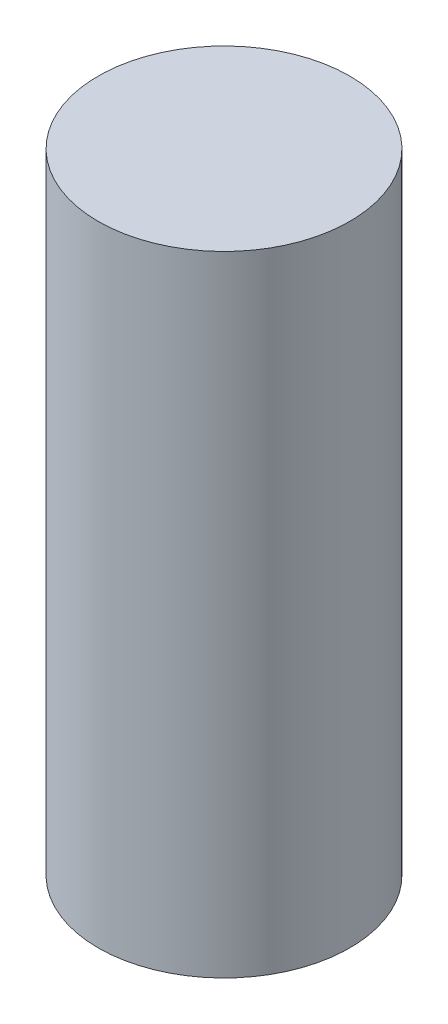
ISO-10303-21;
HEADER;
FILE_DESCRIPTION(('STEP AP214'),'2;1');
FILE_NAME('part.step','',(''),(''),'','','');
FILE_SCHEMA(('AUTOMOTIVE_DESIGN { 1 0 10303 214 1 1 1 1 }'));
ENDSEC;
DATA;
#1=APPLICATION_CONTEXT('core data for automotive mechanical design processes');
#2=APPLICATION_PROTOCOL_DEFINITION('international standard','automotive_design',2000,#1);
#3=PRODUCT_CONTEXT('',#1,'mechanical');
#4=PRODUCT('Part','Part','',(#3));
#5=PRODUCT_RELATED_PRODUCT_CATEGORY('part','',(#4));
#6=PRODUCT_DEFINITION_FORMATION('','',#4);
#7=PRODUCT_DEFINITION_CONTEXT('part definition',#1,'design');
#8=PRODUCT_DEFINITION('design','',#6,#7);
#9=PRODUCT_DEFINITION_SHAPE('','',#8);
#10=(LENGTH_UNIT() NAMED_UNIT(*) SI_UNIT(.MILLI.,.METRE.));
#11=(NAMED_UNIT(*) PLANE_ANGLE_UNIT() SI_UNIT($,.RADIAN.));
#12=(NAMED_UNIT(*) SI_UNIT($,.STERADIAN.) SOLID_ANGLE_UNIT());
#13=UNCERTAINTY_MEASURE_WITH_UNIT(LENGTH_MEASURE(1.E-05),#10,'distance_accuracy_value','');
#14=(GEOMETRIC_REPRESENTATION_CONTEXT(3) GLOBAL_UNCERTAINTY_ASSIGNED_CONTEXT((#13)) GLOBAL_UNIT_ASSIGNED_CONTEXT((#10,
#11,#12)) REPRESENTATION_CONTEXT('',''));
#15=CARTESIAN_POINT('',(0.,0.,0.));
#16=DIRECTION('',(0.,0.,1.));
#17=DIRECTION('',(1.,0.,0.));
#18=AXIS2_PLACEMENT_3D('',#15,#16,#17);
#19=CARTESIAN_POINT('',(0.,40.,0.));
#20=DIRECTION('',(0.,-1.,0.));
#21=DIRECTION('',(0.,0.,-1.));
#22=AXIS2_PLACEMENT_3D('',#19,#20,#21);
#23=CYLINDRICAL_SURFACE('',#22,8.);
#24=CARTESIAN_POINT('',(0.,40.,0.));
#25=DIRECTION('',(0.,1.,0.));
#26=DIRECTION('',(0.,0.,1.));
#27=AXIS2_PLACEMENT_3D('',#24,#25,#26);
#28=CIRCLE('',#27,8.);
#29=CARTESIAN_POINT('',(0.,40.,8.));
#30=VERTEX_POINT('',#29);
#31=EDGE_CURVE('E10',#30,#30,#28,.T.);
#32=ORIENTED_EDGE('',*,*,#31,.F.);
#33=EDGE_LOOP('',(#32));
#34=FACE_BOUND('',#33,.T.);
#35=CARTESIAN_POINT('',(0.,0.,0.));
#36=DIRECTION('',(0.,1.,0.));
#37=DIRECTION('',(0.,0.,1.));
#38=AXIS2_PLACEMENT_3D('',#35,#36,#37);
#39=CIRCLE('',#38,8.);
#40=CARTESIAN_POINT('',(0.,0.,8.));
#41=VERTEX_POINT('',#40);
#42=EDGE_CURVE('E32',#41,#41,#39,.T.);
#43=ORIENTED_EDGE('',*,*,#42,.T.);
#44=EDGE_LOOP('',(#43));
#45=FACE_BOUND('',#44,.T.);
#46=ADVANCED_FACE('F29',(#34,#45),#23,.T.);
#47=CARTESIAN_POINT('',(0.,40.,0.));
#48=DIRECTION('',(0.,1.,0.));
#49=DIRECTION('',(0.,0.,1.));
#50=AXIS2_PLACEMENT_3D('',#47,#48,#49);
#51=PLANE('',#50);
#52=ORIENTED_EDGE('',*,*,#31,.T.);
#53=EDGE_LOOP('',(#52));
#54=FACE_BOUND('',#53,.T.);
#55=ADVANCED_FACE('F44',(#54),#51,.T.);
#56=CARTESIAN_POINT('',(0.,0.,0.));
#57=DIRECTION('',(0.,1.,0.));
#58=DIRECTION('',(0.,0.,1.));
#59=AXIS2_PLACEMENT_3D('',#56,#57,#58);
#60=PLANE('',#59);
#61=ORIENTED_EDGE('',*,*,#42,.F.);
#62=EDGE_LOOP('',(#61));
#63=FACE_BOUND('',#62,.T.);
#64=ADVANCED_FACE('F42',(#63),#60,.F.);
#65=CLOSED_SHELL('',(#46,#55,#64));
#66=MANIFOLD_SOLID_BREP('B2',#65);
#67=ADVANCED_BREP_SHAPE_REPRESENTATION('',(#18,#66),#14);
#68=SHAPE_DEFINITION_REPRESENTATION(#9,#67);
ENDSEC;
END-ISO-10303-21;
